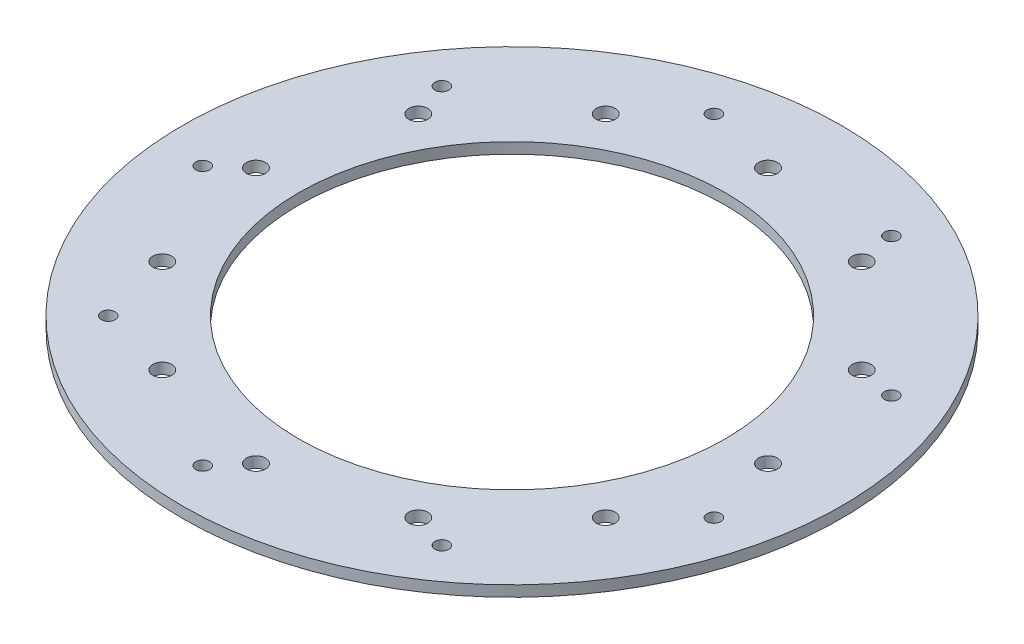
ISO-10303-21;
HEADER;
FILE_DESCRIPTION(('STEP AP214'),'2;1');
FILE_NAME('part.step','',(''),(''),'','','');
FILE_SCHEMA(('AUTOMOTIVE_DESIGN { 1 0 10303 214 1 1 1 1 }'));
ENDSEC;
DATA;
#1=APPLICATION_CONTEXT('core data for automotive mechanical design processes');
#2=APPLICATION_PROTOCOL_DEFINITION('international standard','automotive_design',2000,#1);
#3=PRODUCT_CONTEXT('',#1,'mechanical');
#4=PRODUCT('Part','Part','',(#3));
#5=PRODUCT_RELATED_PRODUCT_CATEGORY('part','',(#4));
#6=PRODUCT_DEFINITION_FORMATION('','',#4);
#7=PRODUCT_DEFINITION_CONTEXT('part definition',#1,'design');
#8=PRODUCT_DEFINITION('design','',#6,#7);
#9=PRODUCT_DEFINITION_SHAPE('','',#8);
#10=(LENGTH_UNIT() NAMED_UNIT(*) SI_UNIT(.MILLI.,.METRE.));
#11=(NAMED_UNIT(*) PLANE_ANGLE_UNIT() SI_UNIT($,.RADIAN.));
#12=(NAMED_UNIT(*) SI_UNIT($,.STERADIAN.) SOLID_ANGLE_UNIT());
#13=UNCERTAINTY_MEASURE_WITH_UNIT(LENGTH_MEASURE(1.E-05),#10,'distance_accuracy_value','');
#14=(GEOMETRIC_REPRESENTATION_CONTEXT(3) GLOBAL_UNCERTAINTY_ASSIGNED_CONTEXT((#13)) GLOBAL_UNIT_ASSIGNED_CONTEXT((#10,
#11,#12)) REPRESENTATION_CONTEXT('',''));
#15=CARTESIAN_POINT('',(0.,0.,0.));
#16=DIRECTION('',(0.,0.,1.));
#17=DIRECTION('',(1.,0.,0.));
#18=AXIS2_PLACEMENT_3D('',#15,#16,#17);
#19=CARTESIAN_POINT('',(0.,2.5,0.));
#20=DIRECTION('',(0.,1.,0.));
#21=DIRECTION('',(0.,0.,1.));
#22=AXIS2_PLACEMENT_3D('',#19,#20,#21);
#23=PLANE('',#22);
#24=CARTESIAN_POINT('',(-17.0820569767662,2.5,-63.7511045350786));
#25=DIRECTION('',(0.,1.,0.));
#26=DIRECTION('',(-0.984807753012209,0.,0.173648177666927));
#27=AXIS2_PLACEMENT_3D('',#24,#25,#26);
#28=CIRCLE('',#27,1.60000000000001);
#29=CARTESIAN_POINT('',(-18.6577493815857,2.5,-63.4732674508115));
#30=VERTEX_POINT('',#29);
#31=EDGE_CURVE('E170',#30,#30,#28,.T.);
#32=ORIENTED_EDGE('',*,*,#31,.F.);
#33=EDGE_LOOP('',(#32));
#34=FACE_BOUND('',#33,.T.);
#35=CARTESIAN_POINT('',(27.8928052748864,2.5,-59.8163139444188));
#36=DIRECTION('',(0.,1.,0.));
#37=DIRECTION('',(-0.866025403784436,0.,-0.500000000000004));
#38=AXIS2_PLACEMENT_3D('',#35,#36,#37);
#39=CIRCLE('',#38,1.60000000000001);
#40=CARTESIAN_POINT('',(26.5071646288313,2.5,-60.6163139444188));
#41=VERTEX_POINT('',#40);
#42=EDGE_CURVE('E164',#41,#41,#39,.T.);
#43=ORIENTED_EDGE('',*,*,#42,.F.);
#44=EDGE_LOOP('',(#43));
#45=FACE_BOUND('',#44,.T.);
#46=CARTESIAN_POINT('',(59.8163139444191,2.5,-27.8928052748858));
#47=DIRECTION('',(0.,1.,0.));
#48=DIRECTION('',(-0.342020143325663,0.,-0.939692620785911));
#49=AXIS2_PLACEMENT_3D('',#46,#47,#48);
#50=CIRCLE('',#49,1.60000000000001);
#51=CARTESIAN_POINT('',(59.269081715098,2.5,-29.3963134681433));
#52=VERTEX_POINT('',#51);
#53=EDGE_CURVE('E158',#52,#52,#50,.T.);
#54=ORIENTED_EDGE('',*,*,#53,.F.);
#55=EDGE_LOOP('',(#54));
#56=FACE_BOUND('',#55,.T.);
#57=CARTESIAN_POINT('',(63.7511045350784,2.5,17.0820569767668));
#58=DIRECTION('',(0.,1.,0.));
#59=DIRECTION('',(0.342020143325676,0.,-0.939692620785906));
#60=AXIS2_PLACEMENT_3D('',#57,#58,#59);
#61=CIRCLE('',#60,1.60000000000001);
#62=CARTESIAN_POINT('',(64.2983367643995,2.5,15.5785487835094));
#63=VERTEX_POINT('',#62);
#64=EDGE_CURVE('E152',#63,#63,#61,.T.);
#65=ORIENTED_EDGE('',*,*,#64,.F.);
#66=EDGE_LOOP('',(#65));
#67=FACE_BOUND('',#66,.T.);
#68=CARTESIAN_POINT('',(37.8560447991686,2.5,54.0640349230738));
#69=DIRECTION('',(0.,1.,0.));
#70=DIRECTION('',(0.866025403784443,0.,-0.499999999999992));
#71=AXIS2_PLACEMENT_3D('',#68,#69,#70);
#72=CIRCLE('',#71,1.60000000000001);
#73=CARTESIAN_POINT('',(39.2416854452237,2.5,53.2640349230738));
#74=VERTEX_POINT('',#73);
#75=EDGE_CURVE('E146',#74,#74,#72,.T.);
#76=ORIENTED_EDGE('',*,*,#75,.F.);
#77=EDGE_LOOP('',(#76));
#78=FACE_BOUND('',#77,.T.);
#79=CARTESIAN_POINT('',(-5.7522790213461,2.5,65.7488500740551));
#80=DIRECTION('',(0.,1.,0.));
#81=DIRECTION('',(0.984807753012206,0.,0.17364817766694));
#82=AXIS2_PLACEMENT_3D('',#79,#80,#81);
#83=CIRCLE('',#82,1.60000000000001);
#84=CARTESIAN_POINT('',(-4.17658661652657,2.5,66.0266871583223));
#85=VERTEX_POINT('',#84);
#86=EDGE_CURVE('E140',#85,#85,#83,.T.);
#87=ORIENTED_EDGE('',*,*,#86,.F.);
#88=EDGE_LOOP('',(#87));
#89=FACE_BOUND('',#88,.T.);
#90=CARTESIAN_POINT('',(-46.6690475583127,2.5,46.6690475583116));
#91=DIRECTION('',(0.,1.,0.));
#92=DIRECTION('',(0.64278760968653,0.,0.766044443118986));
#93=AXIS2_PLACEMENT_3D('',#90,#91,#92);
#94=CIRCLE('',#93,1.60000000000001);
#95=CARTESIAN_POINT('',(-45.6405873828143,2.5,47.894718667302));
#96=VERTEX_POINT('',#95);
#97=EDGE_CURVE('E134',#96,#96,#94,.T.);
#98=ORIENTED_EDGE('',*,*,#97,.F.);
#99=EDGE_LOOP('',(#98));
#100=FACE_BOUND('',#99,.T.);
#101=CARTESIAN_POINT('',(-54.0640349230734,2.5,-37.8560447991691));
#102=DIRECTION('',(0.,1.,0.));
#103=DIRECTION('',(-0.642787609686541,0.,0.766044443118977));
#104=AXIS2_PLACEMENT_3D('',#101,#102,#103);
#105=CIRCLE('',#104,1.60000000000001);
#106=CARTESIAN_POINT('',(-55.0924950985719,2.5,-36.6303736901788));
#107=VERTEX_POINT('',#106);
#108=EDGE_CURVE('E128',#107,#107,#105,.T.);
#109=ORIENTED_EDGE('',*,*,#108,.F.);
#110=EDGE_LOOP('',(#109));
#111=FACE_BOUND('',#110,.T.);
#112=CARTESIAN_POINT('',(29.5899999999978,2.5,-51.2513833959643));
#113=DIRECTION('',(0.,1.,0.));
#114=DIRECTION('',(0.,0.,1.));
#115=AXIS2_PLACEMENT_3D('',#112,#113,#114);
#116=CIRCLE('',#115,2.19999999999999);
#117=CARTESIAN_POINT('',(29.5899999999978,2.5,-49.0513833959643));
#118=VERTEX_POINT('',#117);
#119=EDGE_CURVE('E123',#118,#118,#116,.T.);
#120=ORIENTED_EDGE('',*,*,#119,.F.);
#121=EDGE_LOOP('',(#120));
#122=FACE_BOUND('',#121,.T.);
#123=CARTESIAN_POINT('',(51.2513833959618,2.5,-29.5900000000022));
#124=DIRECTION('',(0.,1.,0.));
#125=DIRECTION('',(0.,0.,1.));
#126=AXIS2_PLACEMENT_3D('',#123,#124,#125);
#127=CIRCLE('',#126,2.20000000000001);
#128=CARTESIAN_POINT('',(51.2513833959618,2.5,-27.3900000000022));
#129=VERTEX_POINT('',#128);
#130=EDGE_CURVE('E117',#129,#129,#127,.T.);
#131=ORIENTED_EDGE('',*,*,#130,.F.);
#132=EDGE_LOOP('',(#131));
#133=FACE_BOUND('',#132,.T.);
#134=CARTESIAN_POINT('',(59.18,2.5,-2.51925216798732E-12));
#135=DIRECTION('',(0.,1.,0.));
#136=DIRECTION('',(0.,0.,1.));
#137=AXIS2_PLACEMENT_3D('',#134,#135,#136);
#138=CIRCLE('',#137,2.2);
#139=CARTESIAN_POINT('',(59.18,2.5,2.19999999999748));
#140=VERTEX_POINT('',#139);
#141=EDGE_CURVE('E111',#140,#140,#138,.T.);
#142=ORIENTED_EDGE('',*,*,#141,.F.);
#143=EDGE_LOOP('',(#142));
#144=FACE_BOUND('',#143,.T.);
#145=CARTESIAN_POINT('',(51.2513833959643,2.5,29.5899999999978));
#146=DIRECTION('',(0.,1.,0.));
#147=DIRECTION('',(0.,0.,1.));
#148=AXIS2_PLACEMENT_3D('',#145,#146,#147);
#149=CIRCLE('',#148,2.2);
#150=CARTESIAN_POINT('',(51.2513833959643,2.5,31.7899999999978));
#151=VERTEX_POINT('',#150);
#152=EDGE_CURVE('E105',#151,#151,#149,.T.);
#153=ORIENTED_EDGE('',*,*,#152,.F.);
#154=EDGE_LOOP('',(#153));
#155=FACE_BOUND('',#154,.T.);
#156=CARTESIAN_POINT('',(29.5900000000022,2.5,51.2513833959618));
#157=DIRECTION('',(0.,1.,0.));
#158=DIRECTION('',(0.,0.,1.));
#159=AXIS2_PLACEMENT_3D('',#156,#157,#158);
#160=CIRCLE('',#159,2.2);
#161=CARTESIAN_POINT('',(29.5900000000022,2.5,53.4513833959618));
#162=VERTEX_POINT('',#161);
#163=EDGE_CURVE('E99',#162,#162,#160,.T.);
#164=ORIENTED_EDGE('',*,*,#163,.F.);
#165=EDGE_LOOP('',(#164));
#166=FACE_BOUND('',#165,.T.);
#167=CARTESIAN_POINT('',(2.5157214821059E-12,2.5,59.18));
#168=DIRECTION('',(0.,1.,0.));
#169=DIRECTION('',(0.,0.,1.));
#170=AXIS2_PLACEMENT_3D('',#167,#168,#169);
#171=CIRCLE('',#170,2.2);
#172=CARTESIAN_POINT('',(2.5157214821059E-12,2.5,61.38));
#173=VERTEX_POINT('',#172);
#174=EDGE_CURVE('E93',#173,#173,#171,.T.);
#175=ORIENTED_EDGE('',*,*,#174,.F.);
#176=EDGE_LOOP('',(#175));
#177=FACE_BOUND('',#176,.T.);
#178=CARTESIAN_POINT('',(-29.5899999999978,2.5,51.2513833959643));
#179=DIRECTION('',(0.,1.,0.));
#180=DIRECTION('',(0.,0.,1.));
#181=AXIS2_PLACEMENT_3D('',#178,#179,#180);
#182=CIRCLE('',#181,2.2);
#183=CARTESIAN_POINT('',(-29.5899999999978,2.5,53.4513833959643));
#184=VERTEX_POINT('',#183);
#185=EDGE_CURVE('E87',#184,#184,#182,.T.);
#186=ORIENTED_EDGE('',*,*,#185,.F.);
#187=EDGE_LOOP('',(#186));
#188=FACE_BOUND('',#187,.T.);
#189=CARTESIAN_POINT('',(-51.2513833959618,2.5,29.5900000000022));
#190=DIRECTION('',(0.,1.,0.));
#191=DIRECTION('',(0.,0.,1.));
#192=AXIS2_PLACEMENT_3D('',#189,#190,#191);
#193=CIRCLE('',#192,2.2);
#194=CARTESIAN_POINT('',(-51.2513833959618,2.5,31.7900000000022));
#195=VERTEX_POINT('',#194);
#196=EDGE_CURVE('E81',#195,#195,#193,.T.);
#197=ORIENTED_EDGE('',*,*,#196,.F.);
#198=EDGE_LOOP('',(#197));
#199=FACE_BOUND('',#198,.T.);
#200=CARTESIAN_POINT('',(-59.18,2.5,2.52662474276022E-12));
#201=DIRECTION('',(0.,1.,0.));
#202=DIRECTION('',(0.,0.,1.));
#203=AXIS2_PLACEMENT_3D('',#200,#201,#202);
#204=CIRCLE('',#203,2.2);
#205=CARTESIAN_POINT('',(-59.18,2.5,2.20000000000253));
#206=VERTEX_POINT('',#205);
#207=EDGE_CURVE('E75',#206,#206,#204,.T.);
#208=ORIENTED_EDGE('',*,*,#207,.F.);
#209=EDGE_LOOP('',(#208));
#210=FACE_BOUND('',#209,.T.);
#211=CARTESIAN_POINT('',(-51.2513833959643,2.5,-29.5899999999978));
#212=DIRECTION('',(0.,1.,0.));
#213=DIRECTION('',(0.,0.,1.));
#214=AXIS2_PLACEMENT_3D('',#211,#212,#213);
#215=CIRCLE('',#214,2.2);
#216=CARTESIAN_POINT('',(-51.2513833959643,2.5,-27.3899999999978));
#217=VERTEX_POINT('',#216);
#218=EDGE_CURVE('E69',#217,#217,#215,.T.);
#219=ORIENTED_EDGE('',*,*,#218,.F.);
#220=EDGE_LOOP('',(#219));
#221=FACE_BOUND('',#220,.T.);
#222=CARTESIAN_POINT('',(-29.5900000000022,2.5,-51.2513833959618));
#223=DIRECTION('',(0.,1.,0.));
#224=DIRECTION('',(0.,0.,1.));
#225=AXIS2_PLACEMENT_3D('',#222,#223,#224);
#226=CIRCLE('',#225,2.2);
#227=CARTESIAN_POINT('',(-29.5900000000022,2.5,-49.0513833959618));
#228=VERTEX_POINT('',#227);
#229=EDGE_CURVE('E62',#228,#228,#226,.T.);
#230=ORIENTED_EDGE('',*,*,#229,.F.);
#231=EDGE_LOOP('',(#230));
#232=FACE_BOUND('',#231,.T.);
#233=CARTESIAN_POINT('',(-2.51573553974758E-12,2.5,-59.18));
#234=DIRECTION('',(0.,1.,0.));
#235=DIRECTION('',(0.,0.,1.));
#236=AXIS2_PLACEMENT_3D('',#233,#234,#235);
#237=CIRCLE('',#236,2.2);
#238=CARTESIAN_POINT('',(-2.51573553974758E-12,2.5,-56.98));
#239=VERTEX_POINT('',#238);
#240=EDGE_CURVE('E56',#239,#239,#237,.T.);
#241=ORIENTED_EDGE('',*,*,#240,.F.);
#242=EDGE_LOOP('',(#241));
#243=FACE_BOUND('',#242,.T.);
#244=CARTESIAN_POINT('',(-65.7488500740552,2.5,5.75227902134545));
#245=DIRECTION('',(0.,1.,0.));
#246=DIRECTION('',(0.,0.,1.));
#247=AXIS2_PLACEMENT_3D('',#244,#245,#246);
#248=CIRCLE('',#247,1.60000000000001);
#249=CARTESIAN_POINT('',(-65.7488500740552,2.5,7.35227902134546));
#250=VERTEX_POINT('',#249);
#251=EDGE_CURVE('E50',#250,#250,#248,.T.);
#252=ORIENTED_EDGE('',*,*,#251,.F.);
#253=EDGE_LOOP('',(#252));
#254=FACE_BOUND('',#253,.T.);
#255=CARTESIAN_POINT('',(0.,2.5,0.));
#256=DIRECTION('',(0.,1.,0.));
#257=DIRECTION('',(0.,0.,1.));
#258=AXIS2_PLACEMENT_3D('',#255,#256,#257);
#259=CIRCLE('',#258,76.182);
#260=CARTESIAN_POINT('',(0.,2.5,76.182));
#261=VERTEX_POINT('',#260);
#262=EDGE_CURVE('E10',#261,#261,#259,.T.);
#263=ORIENTED_EDGE('',*,*,#262,.T.);
#264=EDGE_LOOP('',(#263));
#265=FACE_BOUND('',#264,.T.);
#266=CARTESIAN_POINT('',(0.,2.5,0.));
#267=DIRECTION('',(0.,1.,0.));
#268=DIRECTION('',(0.,0.,1.));
#269=AXIS2_PLACEMENT_3D('',#266,#267,#268);
#270=CIRCLE('',#269,49.3);
#271=CARTESIAN_POINT('',(0.,2.5,49.3));
#272=VERTEX_POINT('',#271);
#273=EDGE_CURVE('E42',#272,#272,#270,.T.);
#274=ORIENTED_EDGE('',*,*,#273,.F.);
#275=EDGE_LOOP('',(#274));
#276=FACE_BOUND('',#275,.T.);
#277=ADVANCED_FACE('F31',(#34,#45,#56,#67,#78,#89,#100,#111,#122,#133,#144,#155,#166,#177,#188,
#199,#210,#221,#232,#243,#254,#265,#276),#23,.T.);
#278=CARTESIAN_POINT('',(0.,0.,0.));
#279=DIRECTION('',(0.,1.,0.));
#280=DIRECTION('',(0.,0.,1.));
#281=AXIS2_PLACEMENT_3D('',#278,#279,#280);
#282=PLANE('',#281);
#283=CARTESIAN_POINT('',(-17.0820569767662,0.,-63.7511045350786));
#284=DIRECTION('',(0.,1.,0.));
#285=DIRECTION('',(-0.984807753012209,0.,0.173648177666927));
#286=AXIS2_PLACEMENT_3D('',#283,#284,#285);
#287=CIRCLE('',#286,1.60000000000001);
#288=CARTESIAN_POINT('',(-18.6577493815857,0.,-63.4732674508115));
#289=VERTEX_POINT('',#288);
#290=EDGE_CURVE('E131',#289,#289,#287,.T.);
#291=ORIENTED_EDGE('',*,*,#290,.T.);
#292=EDGE_LOOP('',(#291));
#293=FACE_BOUND('',#292,.T.);
#294=CARTESIAN_POINT('',(27.8928052748864,0.,-59.8163139444188));
#295=DIRECTION('',(0.,1.,0.));
#296=DIRECTION('',(-0.866025403784436,0.,-0.500000000000004));
#297=AXIS2_PLACEMENT_3D('',#294,#295,#296);
#298=CIRCLE('',#297,1.60000000000001);
#299=CARTESIAN_POINT('',(26.5071646288313,0.,-60.6163139444188));
#300=VERTEX_POINT('',#299);
#301=EDGE_CURVE('E167',#300,#300,#298,.T.);
#302=ORIENTED_EDGE('',*,*,#301,.T.);
#303=EDGE_LOOP('',(#302));
#304=FACE_BOUND('',#303,.T.);
#305=CARTESIAN_POINT('',(59.8163139444191,0.,-27.8928052748858));
#306=DIRECTION('',(0.,1.,0.));
#307=DIRECTION('',(-0.342020143325663,0.,-0.939692620785911));
#308=AXIS2_PLACEMENT_3D('',#305,#306,#307);
#309=CIRCLE('',#308,1.60000000000001);
#310=CARTESIAN_POINT('',(59.269081715098,0.,-29.3963134681433));
#311=VERTEX_POINT('',#310);
#312=EDGE_CURVE('E161',#311,#311,#309,.T.);
#313=ORIENTED_EDGE('',*,*,#312,.T.);
#314=EDGE_LOOP('',(#313));
#315=FACE_BOUND('',#314,.T.);
#316=CARTESIAN_POINT('',(63.7511045350784,0.,17.0820569767668));
#317=DIRECTION('',(0.,1.,0.));
#318=DIRECTION('',(0.342020143325676,0.,-0.939692620785906));
#319=AXIS2_PLACEMENT_3D('',#316,#317,#318);
#320=CIRCLE('',#319,1.60000000000001);
#321=CARTESIAN_POINT('',(64.2983367643995,0.,15.5785487835094));
#322=VERTEX_POINT('',#321);
#323=EDGE_CURVE('E155',#322,#322,#320,.T.);
#324=ORIENTED_EDGE('',*,*,#323,.T.);
#325=EDGE_LOOP('',(#324));
#326=FACE_BOUND('',#325,.T.);
#327=CARTESIAN_POINT('',(37.8560447991686,0.,54.0640349230738));
#328=DIRECTION('',(0.,1.,0.));
#329=DIRECTION('',(0.866025403784443,0.,-0.499999999999992));
#330=AXIS2_PLACEMENT_3D('',#327,#328,#329);
#331=CIRCLE('',#330,1.60000000000001);
#332=CARTESIAN_POINT('',(39.2416854452237,0.,53.2640349230738));
#333=VERTEX_POINT('',#332);
#334=EDGE_CURVE('E149',#333,#333,#331,.T.);
#335=ORIENTED_EDGE('',*,*,#334,.T.);
#336=EDGE_LOOP('',(#335));
#337=FACE_BOUND('',#336,.T.);
#338=CARTESIAN_POINT('',(-5.7522790213461,0.,65.7488500740551));
#339=DIRECTION('',(0.,1.,0.));
#340=DIRECTION('',(0.984807753012206,0.,0.17364817766694));
#341=AXIS2_PLACEMENT_3D('',#338,#339,#340);
#342=CIRCLE('',#341,1.60000000000001);
#343=CARTESIAN_POINT('',(-4.17658661652657,0.,66.0266871583223));
#344=VERTEX_POINT('',#343);
#345=EDGE_CURVE('E143',#344,#344,#342,.T.);
#346=ORIENTED_EDGE('',*,*,#345,.T.);
#347=EDGE_LOOP('',(#346));
#348=FACE_BOUND('',#347,.T.);
#349=CARTESIAN_POINT('',(-46.6690475583127,0.,46.6690475583116));
#350=DIRECTION('',(0.,1.,0.));
#351=DIRECTION('',(0.64278760968653,0.,0.766044443118986));
#352=AXIS2_PLACEMENT_3D('',#349,#350,#351);
#353=CIRCLE('',#352,1.60000000000001);
#354=CARTESIAN_POINT('',(-45.6405873828143,0.,47.894718667302));
#355=VERTEX_POINT('',#354);
#356=EDGE_CURVE('E137',#355,#355,#353,.T.);
#357=ORIENTED_EDGE('',*,*,#356,.T.);
#358=EDGE_LOOP('',(#357));
#359=FACE_BOUND('',#358,.T.);
#360=CARTESIAN_POINT('',(-54.0640349230734,0.,-37.8560447991691));
#361=DIRECTION('',(0.,1.,0.));
#362=DIRECTION('',(-0.642787609686541,0.,0.766044443118977));
#363=AXIS2_PLACEMENT_3D('',#360,#361,#362);
#364=CIRCLE('',#363,1.60000000000001);
#365=CARTESIAN_POINT('',(-55.0924950985719,0.,-36.6303736901788));
#366=VERTEX_POINT('',#365);
#367=EDGE_CURVE('E66',#366,#366,#364,.T.);
#368=ORIENTED_EDGE('',*,*,#367,.T.);
#369=EDGE_LOOP('',(#368));
#370=FACE_BOUND('',#369,.T.);
#371=CARTESIAN_POINT('',(29.5899999999978,0.,-51.2513833959643));
#372=DIRECTION('',(0.,1.,0.));
#373=DIRECTION('',(0.,0.,1.));
#374=AXIS2_PLACEMENT_3D('',#371,#372,#373);
#375=CIRCLE('',#374,2.19999999999999);
#376=CARTESIAN_POINT('',(29.5899999999978,0.,-49.0513833959643));
#377=VERTEX_POINT('',#376);
#378=EDGE_CURVE('E59',#377,#377,#375,.T.);
#379=ORIENTED_EDGE('',*,*,#378,.T.);
#380=EDGE_LOOP('',(#379));
#381=FACE_BOUND('',#380,.T.);
#382=CARTESIAN_POINT('',(51.2513833959618,0.,-29.5900000000022));
#383=DIRECTION('',(0.,1.,0.));
#384=DIRECTION('',(0.,0.,1.));
#385=AXIS2_PLACEMENT_3D('',#382,#383,#384);
#386=CIRCLE('',#385,2.20000000000001);
#387=CARTESIAN_POINT('',(51.2513833959618,0.,-27.3900000000022));
#388=VERTEX_POINT('',#387);
#389=EDGE_CURVE('E120',#388,#388,#386,.T.);
#390=ORIENTED_EDGE('',*,*,#389,.T.);
#391=EDGE_LOOP('',(#390));
#392=FACE_BOUND('',#391,.T.);
#393=CARTESIAN_POINT('',(59.18,0.,-2.51925216798732E-12));
#394=DIRECTION('',(0.,1.,0.));
#395=DIRECTION('',(0.,0.,1.));
#396=AXIS2_PLACEMENT_3D('',#393,#394,#395);
#397=CIRCLE('',#396,2.2);
#398=CARTESIAN_POINT('',(59.18,0.,2.19999999999748));
#399=VERTEX_POINT('',#398);
#400=EDGE_CURVE('E114',#399,#399,#397,.T.);
#401=ORIENTED_EDGE('',*,*,#400,.T.);
#402=EDGE_LOOP('',(#401));
#403=FACE_BOUND('',#402,.T.);
#404=CARTESIAN_POINT('',(51.2513833959643,0.,29.5899999999978));
#405=DIRECTION('',(0.,1.,0.));
#406=DIRECTION('',(0.,0.,1.));
#407=AXIS2_PLACEMENT_3D('',#404,#405,#406);
#408=CIRCLE('',#407,2.2);
#409=CARTESIAN_POINT('',(51.2513833959643,0.,31.7899999999978));
#410=VERTEX_POINT('',#409);
#411=EDGE_CURVE('E108',#410,#410,#408,.T.);
#412=ORIENTED_EDGE('',*,*,#411,.T.);
#413=EDGE_LOOP('',(#412));
#414=FACE_BOUND('',#413,.T.);
#415=CARTESIAN_POINT('',(29.5900000000022,0.,51.2513833959618));
#416=DIRECTION('',(0.,1.,0.));
#417=DIRECTION('',(0.,0.,1.));
#418=AXIS2_PLACEMENT_3D('',#415,#416,#417);
#419=CIRCLE('',#418,2.2);
#420=CARTESIAN_POINT('',(29.5900000000022,0.,53.4513833959618));
#421=VERTEX_POINT('',#420);
#422=EDGE_CURVE('E102',#421,#421,#419,.T.);
#423=ORIENTED_EDGE('',*,*,#422,.T.);
#424=EDGE_LOOP('',(#423));
#425=FACE_BOUND('',#424,.T.);
#426=CARTESIAN_POINT('',(2.5157214821059E-12,0.,59.18));
#427=DIRECTION('',(0.,1.,0.));
#428=DIRECTION('',(0.,0.,1.));
#429=AXIS2_PLACEMENT_3D('',#426,#427,#428);
#430=CIRCLE('',#429,2.2);
#431=CARTESIAN_POINT('',(2.5157214821059E-12,0.,61.38));
#432=VERTEX_POINT('',#431);
#433=EDGE_CURVE('E96',#432,#432,#430,.T.);
#434=ORIENTED_EDGE('',*,*,#433,.T.);
#435=EDGE_LOOP('',(#434));
#436=FACE_BOUND('',#435,.T.);
#437=CARTESIAN_POINT('',(-29.5899999999978,0.,51.2513833959643));
#438=DIRECTION('',(0.,1.,0.));
#439=DIRECTION('',(0.,0.,1.));
#440=AXIS2_PLACEMENT_3D('',#437,#438,#439);
#441=CIRCLE('',#440,2.2);
#442=CARTESIAN_POINT('',(-29.5899999999978,0.,53.4513833959643));
#443=VERTEX_POINT('',#442);
#444=EDGE_CURVE('E90',#443,#443,#441,.T.);
#445=ORIENTED_EDGE('',*,*,#444,.T.);
#446=EDGE_LOOP('',(#445));
#447=FACE_BOUND('',#446,.T.);
#448=CARTESIAN_POINT('',(-51.2513833959618,0.,29.5900000000022));
#449=DIRECTION('',(0.,1.,0.));
#450=DIRECTION('',(0.,0.,1.));
#451=AXIS2_PLACEMENT_3D('',#448,#449,#450);
#452=CIRCLE('',#451,2.2);
#453=CARTESIAN_POINT('',(-51.2513833959618,0.,31.7900000000022));
#454=VERTEX_POINT('',#453);
#455=EDGE_CURVE('E84',#454,#454,#452,.T.);
#456=ORIENTED_EDGE('',*,*,#455,.T.);
#457=EDGE_LOOP('',(#456));
#458=FACE_BOUND('',#457,.T.);
#459=CARTESIAN_POINT('',(-59.18,0.,2.52662474276022E-12));
#460=DIRECTION('',(0.,1.,0.));
#461=DIRECTION('',(0.,0.,1.));
#462=AXIS2_PLACEMENT_3D('',#459,#460,#461);
#463=CIRCLE('',#462,2.2);
#464=CARTESIAN_POINT('',(-59.18,0.,2.20000000000253));
#465=VERTEX_POINT('',#464);
#466=EDGE_CURVE('E78',#465,#465,#463,.T.);
#467=ORIENTED_EDGE('',*,*,#466,.T.);
#468=EDGE_LOOP('',(#467));
#469=FACE_BOUND('',#468,.T.);
#470=CARTESIAN_POINT('',(-51.2513833959643,0.,-29.5899999999978));
#471=DIRECTION('',(0.,1.,0.));
#472=DIRECTION('',(0.,0.,1.));
#473=AXIS2_PLACEMENT_3D('',#470,#471,#472);
#474=CIRCLE('',#473,2.2);
#475=CARTESIAN_POINT('',(-51.2513833959643,0.,-27.3899999999978));
#476=VERTEX_POINT('',#475);
#477=EDGE_CURVE('E72',#476,#476,#474,.T.);
#478=ORIENTED_EDGE('',*,*,#477,.T.);
#479=EDGE_LOOP('',(#478));
#480=FACE_BOUND('',#479,.T.);
#481=CARTESIAN_POINT('',(-29.5900000000022,0.,-51.2513833959618));
#482=DIRECTION('',(0.,1.,0.));
#483=DIRECTION('',(0.,0.,1.));
#484=AXIS2_PLACEMENT_3D('',#481,#482,#483);
#485=CIRCLE('',#484,2.2);
#486=CARTESIAN_POINT('',(-29.5900000000022,0.,-49.0513833959618));
#487=VERTEX_POINT('',#486);
#488=EDGE_CURVE('E65',#487,#487,#485,.T.);
#489=ORIENTED_EDGE('',*,*,#488,.T.);
#490=EDGE_LOOP('',(#489));
#491=FACE_BOUND('',#490,.T.);
#492=CARTESIAN_POINT('',(-2.51573553974758E-12,0.,-59.18));
#493=DIRECTION('',(0.,1.,0.));
#494=DIRECTION('',(0.,0.,1.));
#495=AXIS2_PLACEMENT_3D('',#492,#493,#494);
#496=CIRCLE('',#495,2.2);
#497=CARTESIAN_POINT('',(-2.51573553974758E-12,0.,-56.98));
#498=VERTEX_POINT('',#497);
#499=EDGE_CURVE('E53',#498,#498,#496,.T.);
#500=ORIENTED_EDGE('',*,*,#499,.T.);
#501=EDGE_LOOP('',(#500));
#502=FACE_BOUND('',#501,.T.);
#503=CARTESIAN_POINT('',(-65.7488500740552,0.,5.75227902134545));
#504=DIRECTION('',(0.,1.,0.));
#505=DIRECTION('',(0.,0.,1.));
#506=AXIS2_PLACEMENT_3D('',#503,#504,#505);
#507=CIRCLE('',#506,1.60000000000001);
#508=CARTESIAN_POINT('',(-65.7488500740552,0.,7.35227902134546));
#509=VERTEX_POINT('',#508);
#510=EDGE_CURVE('E47',#509,#509,#507,.T.);
#511=ORIENTED_EDGE('',*,*,#510,.T.);
#512=EDGE_LOOP('',(#511));
#513=FACE_BOUND('',#512,.T.);
#514=CARTESIAN_POINT('',(0.,0.,0.));
#515=DIRECTION('',(0.,1.,0.));
#516=DIRECTION('',(0.,0.,1.));
#517=AXIS2_PLACEMENT_3D('',#514,#515,#516);
#518=CIRCLE('',#517,76.182);
#519=CARTESIAN_POINT('',(0.,0.,76.182));
#520=VERTEX_POINT('',#519);
#521=EDGE_CURVE('E35',#520,#520,#518,.T.);
#522=ORIENTED_EDGE('',*,*,#521,.F.);
#523=EDGE_LOOP('',(#522));
#524=FACE_BOUND('',#523,.T.);
#525=CARTESIAN_POINT('',(0.,0.,0.));
#526=DIRECTION('',(0.,1.,0.));
#527=DIRECTION('',(0.,0.,1.));
#528=AXIS2_PLACEMENT_3D('',#525,#526,#527);
#529=CIRCLE('',#528,49.3);
#530=CARTESIAN_POINT('',(0.,0.,49.3));
#531=VERTEX_POINT('',#530);
#532=EDGE_CURVE('E44',#531,#531,#529,.T.);
#533=ORIENTED_EDGE('',*,*,#532,.T.);
#534=EDGE_LOOP('',(#533));
#535=FACE_BOUND('',#534,.T.);
#536=ADVANCED_FACE('F176',(#293,#304,#315,#326,#337,#348,#359,#370,#381,#392,#403,#414,#425,
#436,#447,#458,#469,#480,#491,#502,#513,#524,#535),#282,.F.);
#537=CARTESIAN_POINT('',(0.,2.5,0.));
#538=DIRECTION('',(0.,-1.,0.));
#539=DIRECTION('',(0.,0.,-1.));
#540=AXIS2_PLACEMENT_3D('',#537,#538,#539);
#541=CYLINDRICAL_SURFACE('',#540,76.182);
#542=ORIENTED_EDGE('',*,*,#262,.F.);
#543=EDGE_LOOP('',(#542));
#544=FACE_BOUND('',#543,.T.);
#545=ORIENTED_EDGE('',*,*,#521,.T.);
#546=EDGE_LOOP('',(#545));
#547=FACE_BOUND('',#546,.T.);
#548=ADVANCED_FACE('F33',(#544,#547),#541,.T.);
#549=CARTESIAN_POINT('',(0.,2.5,0.));
#550=DIRECTION('',(0.,-1.,0.));
#551=DIRECTION('',(0.,0.,-1.));
#552=AXIS2_PLACEMENT_3D('',#549,#550,#551);
#553=CYLINDRICAL_SURFACE('',#552,49.3);
#554=ORIENTED_EDGE('',*,*,#273,.T.);
#555=EDGE_LOOP('',(#554));
#556=FACE_BOUND('',#555,.T.);
#557=ORIENTED_EDGE('',*,*,#532,.F.);
#558=EDGE_LOOP('',(#557));
#559=FACE_BOUND('',#558,.T.);
#560=ADVANCED_FACE('F231',(#556,#559),#553,.F.);
#561=CARTESIAN_POINT('',(-65.7488500740552,0.,5.75227902134545));
#562=DIRECTION('',(0.,1.,0.));
#563=DIRECTION('',(0.,0.,1.));
#564=AXIS2_PLACEMENT_3D('',#561,#562,#563);
#565=CYLINDRICAL_SURFACE('',#564,1.60000000000001);
#566=ORIENTED_EDGE('',*,*,#510,.F.);
#567=EDGE_LOOP('',(#566));
#568=FACE_BOUND('',#567,.T.);
#569=ORIENTED_EDGE('',*,*,#251,.T.);
#570=EDGE_LOOP('',(#569));
#571=FACE_BOUND('',#570,.T.);
#572=ADVANCED_FACE('F234',(#568,#571),#565,.F.);
#573=CARTESIAN_POINT('',(-2.51573553974758E-12,0.,-59.18));
#574=DIRECTION('',(0.,1.,0.));
#575=DIRECTION('',(0.,0.,1.));
#576=AXIS2_PLACEMENT_3D('',#573,#574,#575);
#577=CYLINDRICAL_SURFACE('',#576,2.2);
#578=ORIENTED_EDGE('',*,*,#499,.F.);
#579=EDGE_LOOP('',(#578));
#580=FACE_BOUND('',#579,.T.);
#581=ORIENTED_EDGE('',*,*,#240,.T.);
#582=EDGE_LOOP('',(#581));
#583=FACE_BOUND('',#582,.T.);
#584=ADVANCED_FACE('F246',(#580,#583),#577,.F.);
#585=CARTESIAN_POINT('',(-29.5900000000022,0.,-51.2513833959618));
#586=DIRECTION('',(0.,1.,0.));
#587=DIRECTION('',(0.,0.,1.));
#588=AXIS2_PLACEMENT_3D('',#585,#586,#587);
#589=CYLINDRICAL_SURFACE('',#588,2.2);
#590=ORIENTED_EDGE('',*,*,#488,.F.);
#591=EDGE_LOOP('',(#590));
#592=FACE_BOUND('',#591,.T.);
#593=ORIENTED_EDGE('',*,*,#229,.T.);
#594=EDGE_LOOP('',(#593));
#595=FACE_BOUND('',#594,.T.);
#596=ADVANCED_FACE('F250',(#592,#595),#589,.F.);
#597=CARTESIAN_POINT('',(-51.2513833959643,0.,-29.5899999999978));
#598=DIRECTION('',(0.,1.,0.));
#599=DIRECTION('',(0.,0.,1.));
#600=AXIS2_PLACEMENT_3D('',#597,#598,#599);
#601=CYLINDRICAL_SURFACE('',#600,2.2);
#602=ORIENTED_EDGE('',*,*,#477,.F.);
#603=EDGE_LOOP('',(#602));
#604=FACE_BOUND('',#603,.T.);
#605=ORIENTED_EDGE('',*,*,#218,.T.);
#606=EDGE_LOOP('',(#605));
#607=FACE_BOUND('',#606,.T.);
#608=ADVANCED_FACE('F254',(#604,#607),#601,.F.);
#609=CARTESIAN_POINT('',(-59.18,0.,2.52662474276022E-12));
#610=DIRECTION('',(0.,1.,0.));
#611=DIRECTION('',(0.,0.,1.));
#612=AXIS2_PLACEMENT_3D('',#609,#610,#611);
#613=CYLINDRICAL_SURFACE('',#612,2.2);
#614=ORIENTED_EDGE('',*,*,#466,.F.);
#615=EDGE_LOOP('',(#614));
#616=FACE_BOUND('',#615,.T.);
#617=ORIENTED_EDGE('',*,*,#207,.T.);
#618=EDGE_LOOP('',(#617));
#619=FACE_BOUND('',#618,.T.);
#620=ADVANCED_FACE('F258',(#616,#619),#613,.F.);
#621=CARTESIAN_POINT('',(-51.2513833959618,0.,29.5900000000022));
#622=DIRECTION('',(0.,1.,0.));
#623=DIRECTION('',(0.,0.,1.));
#624=AXIS2_PLACEMENT_3D('',#621,#622,#623);
#625=CYLINDRICAL_SURFACE('',#624,2.2);
#626=ORIENTED_EDGE('',*,*,#455,.F.);
#627=EDGE_LOOP('',(#626));
#628=FACE_BOUND('',#627,.T.);
#629=ORIENTED_EDGE('',*,*,#196,.T.);
#630=EDGE_LOOP('',(#629));
#631=FACE_BOUND('',#630,.T.);
#632=ADVANCED_FACE('F262',(#628,#631),#625,.F.);
#633=CARTESIAN_POINT('',(-29.5899999999978,0.,51.2513833959643));
#634=DIRECTION('',(0.,1.,0.));
#635=DIRECTION('',(0.,0.,1.));
#636=AXIS2_PLACEMENT_3D('',#633,#634,#635);
#637=CYLINDRICAL_SURFACE('',#636,2.2);
#638=ORIENTED_EDGE('',*,*,#444,.F.);
#639=EDGE_LOOP('',(#638));
#640=FACE_BOUND('',#639,.T.);
#641=ORIENTED_EDGE('',*,*,#185,.T.);
#642=EDGE_LOOP('',(#641));
#643=FACE_BOUND('',#642,.T.);
#644=ADVANCED_FACE('F266',(#640,#643),#637,.F.);
#645=CARTESIAN_POINT('',(2.5157214821059E-12,0.,59.18));
#646=DIRECTION('',(0.,1.,0.));
#647=DIRECTION('',(0.,0.,1.));
#648=AXIS2_PLACEMENT_3D('',#645,#646,#647);
#649=CYLINDRICAL_SURFACE('',#648,2.2);
#650=ORIENTED_EDGE('',*,*,#433,.F.);
#651=EDGE_LOOP('',(#650));
#652=FACE_BOUND('',#651,.T.);
#653=ORIENTED_EDGE('',*,*,#174,.T.);
#654=EDGE_LOOP('',(#653));
#655=FACE_BOUND('',#654,.T.);
#656=ADVANCED_FACE('F270',(#652,#655),#649,.F.);
#657=CARTESIAN_POINT('',(29.5900000000022,0.,51.2513833959618));
#658=DIRECTION('',(0.,1.,0.));
#659=DIRECTION('',(0.,0.,1.));
#660=AXIS2_PLACEMENT_3D('',#657,#658,#659);
#661=CYLINDRICAL_SURFACE('',#660,2.2);
#662=ORIENTED_EDGE('',*,*,#422,.F.);
#663=EDGE_LOOP('',(#662));
#664=FACE_BOUND('',#663,.T.);
#665=ORIENTED_EDGE('',*,*,#163,.T.);
#666=EDGE_LOOP('',(#665));
#667=FACE_BOUND('',#666,.T.);
#668=ADVANCED_FACE('F274',(#664,#667),#661,.F.);
#669=CARTESIAN_POINT('',(51.2513833959643,0.,29.5899999999978));
#670=DIRECTION('',(0.,1.,0.));
#671=DIRECTION('',(0.,0.,1.));
#672=AXIS2_PLACEMENT_3D('',#669,#670,#671);
#673=CYLINDRICAL_SURFACE('',#672,2.2);
#674=ORIENTED_EDGE('',*,*,#411,.F.);
#675=EDGE_LOOP('',(#674));
#676=FACE_BOUND('',#675,.T.);
#677=ORIENTED_EDGE('',*,*,#152,.T.);
#678=EDGE_LOOP('',(#677));
#679=FACE_BOUND('',#678,.T.);
#680=ADVANCED_FACE('F278',(#676,#679),#673,.F.);
#681=CARTESIAN_POINT('',(59.18,0.,-2.51925216798732E-12));
#682=DIRECTION('',(0.,1.,0.));
#683=DIRECTION('',(0.,0.,1.));
#684=AXIS2_PLACEMENT_3D('',#681,#682,#683);
#685=CYLINDRICAL_SURFACE('',#684,2.2);
#686=ORIENTED_EDGE('',*,*,#400,.F.);
#687=EDGE_LOOP('',(#686));
#688=FACE_BOUND('',#687,.T.);
#689=ORIENTED_EDGE('',*,*,#141,.T.);
#690=EDGE_LOOP('',(#689));
#691=FACE_BOUND('',#690,.T.);
#692=ADVANCED_FACE('F282',(#688,#691),#685,.F.);
#693=CARTESIAN_POINT('',(51.2513833959618,0.,-29.5900000000022));
#694=DIRECTION('',(0.,1.,0.));
#695=DIRECTION('',(0.,0.,1.));
#696=AXIS2_PLACEMENT_3D('',#693,#694,#695);
#697=CYLINDRICAL_SURFACE('',#696,2.20000000000001);
#698=ORIENTED_EDGE('',*,*,#389,.F.);
#699=EDGE_LOOP('',(#698));
#700=FACE_BOUND('',#699,.T.);
#701=ORIENTED_EDGE('',*,*,#130,.T.);
#702=EDGE_LOOP('',(#701));
#703=FACE_BOUND('',#702,.T.);
#704=ADVANCED_FACE('F286',(#700,#703),#697,.F.);
#705=CARTESIAN_POINT('',(29.5899999999978,0.,-51.2513833959643));
#706=DIRECTION('',(0.,1.,0.));
#707=DIRECTION('',(0.,0.,1.));
#708=AXIS2_PLACEMENT_3D('',#705,#706,#707);
#709=CYLINDRICAL_SURFACE('',#708,2.19999999999999);
#710=ORIENTED_EDGE('',*,*,#378,.F.);
#711=EDGE_LOOP('',(#710));
#712=FACE_BOUND('',#711,.T.);
#713=ORIENTED_EDGE('',*,*,#119,.T.);
#714=EDGE_LOOP('',(#713));
#715=FACE_BOUND('',#714,.T.);
#716=ADVANCED_FACE('F290',(#712,#715),#709,.F.);
#717=CARTESIAN_POINT('',(-54.0640349230734,0.,-37.8560447991691));
#718=DIRECTION('',(0.,1.,0.));
#719=DIRECTION('',(0.,0.,1.));
#720=AXIS2_PLACEMENT_3D('',#717,#718,#719);
#721=CYLINDRICAL_SURFACE('',#720,1.60000000000001);
#722=ORIENTED_EDGE('',*,*,#367,.F.);
#723=EDGE_LOOP('',(#722));
#724=FACE_BOUND('',#723,.T.);
#725=ORIENTED_EDGE('',*,*,#108,.T.);
#726=EDGE_LOOP('',(#725));
#727=FACE_BOUND('',#726,.T.);
#728=ADVANCED_FACE('F294',(#724,#727),#721,.F.);
#729=CARTESIAN_POINT('',(-46.6690475583127,0.,46.6690475583116));
#730=DIRECTION('',(0.,1.,0.));
#731=DIRECTION('',(0.,0.,1.));
#732=AXIS2_PLACEMENT_3D('',#729,#730,#731);
#733=CYLINDRICAL_SURFACE('',#732,1.60000000000001);
#734=ORIENTED_EDGE('',*,*,#356,.F.);
#735=EDGE_LOOP('',(#734));
#736=FACE_BOUND('',#735,.T.);
#737=ORIENTED_EDGE('',*,*,#97,.T.);
#738=EDGE_LOOP('',(#737));
#739=FACE_BOUND('',#738,.T.);
#740=ADVANCED_FACE('F298',(#736,#739),#733,.F.);
#741=CARTESIAN_POINT('',(-5.7522790213461,0.,65.7488500740551));
#742=DIRECTION('',(0.,1.,0.));
#743=DIRECTION('',(0.,0.,1.));
#744=AXIS2_PLACEMENT_3D('',#741,#742,#743);
#745=CYLINDRICAL_SURFACE('',#744,1.60000000000001);
#746=ORIENTED_EDGE('',*,*,#345,.F.);
#747=EDGE_LOOP('',(#746));
#748=FACE_BOUND('',#747,.T.);
#749=ORIENTED_EDGE('',*,*,#86,.T.);
#750=EDGE_LOOP('',(#749));
#751=FACE_BOUND('',#750,.T.);
#752=ADVANCED_FACE('F302',(#748,#751),#745,.F.);
#753=CARTESIAN_POINT('',(37.8560447991686,0.,54.0640349230738));
#754=DIRECTION('',(0.,1.,0.));
#755=DIRECTION('',(0.,0.,1.));
#756=AXIS2_PLACEMENT_3D('',#753,#754,#755);
#757=CYLINDRICAL_SURFACE('',#756,1.60000000000001);
#758=ORIENTED_EDGE('',*,*,#334,.F.);
#759=EDGE_LOOP('',(#758));
#760=FACE_BOUND('',#759,.T.);
#761=ORIENTED_EDGE('',*,*,#75,.T.);
#762=EDGE_LOOP('',(#761));
#763=FACE_BOUND('',#762,.T.);
#764=ADVANCED_FACE('F306',(#760,#763),#757,.F.);
#765=CARTESIAN_POINT('',(63.7511045350784,0.,17.0820569767668));
#766=DIRECTION('',(0.,1.,0.));
#767=DIRECTION('',(0.,0.,1.));
#768=AXIS2_PLACEMENT_3D('',#765,#766,#767);
#769=CYLINDRICAL_SURFACE('',#768,1.60000000000001);
#770=ORIENTED_EDGE('',*,*,#323,.F.);
#771=EDGE_LOOP('',(#770));
#772=FACE_BOUND('',#771,.T.);
#773=ORIENTED_EDGE('',*,*,#64,.T.);
#774=EDGE_LOOP('',(#773));
#775=FACE_BOUND('',#774,.T.);
#776=ADVANCED_FACE('F310',(#772,#775),#769,.F.);
#777=CARTESIAN_POINT('',(59.8163139444191,0.,-27.8928052748858));
#778=DIRECTION('',(0.,1.,0.));
#779=DIRECTION('',(0.,0.,1.));
#780=AXIS2_PLACEMENT_3D('',#777,#778,#779);
#781=CYLINDRICAL_SURFACE('',#780,1.60000000000001);
#782=ORIENTED_EDGE('',*,*,#312,.F.);
#783=EDGE_LOOP('',(#782));
#784=FACE_BOUND('',#783,.T.);
#785=ORIENTED_EDGE('',*,*,#53,.T.);
#786=EDGE_LOOP('',(#785));
#787=FACE_BOUND('',#786,.T.);
#788=ADVANCED_FACE('F314',(#784,#787),#781,.F.);
#789=CARTESIAN_POINT('',(27.8928052748864,0.,-59.8163139444188));
#790=DIRECTION('',(0.,1.,0.));
#791=DIRECTION('',(0.,0.,1.));
#792=AXIS2_PLACEMENT_3D('',#789,#790,#791);
#793=CYLINDRICAL_SURFACE('',#792,1.60000000000001);
#794=ORIENTED_EDGE('',*,*,#301,.F.);
#795=EDGE_LOOP('',(#794));
#796=FACE_BOUND('',#795,.T.);
#797=ORIENTED_EDGE('',*,*,#42,.T.);
#798=EDGE_LOOP('',(#797));
#799=FACE_BOUND('',#798,.T.);
#800=ADVANCED_FACE('F182',(#796,#799),#793,.F.);
#801=CARTESIAN_POINT('',(-17.0820569767662,0.,-63.7511045350786));
#802=DIRECTION('',(0.,1.,0.));
#803=DIRECTION('',(0.,0.,1.));
#804=AXIS2_PLACEMENT_3D('',#801,#802,#803);
#805=CYLINDRICAL_SURFACE('',#804,1.60000000000001);
#806=ORIENTED_EDGE('',*,*,#290,.F.);
#807=EDGE_LOOP('',(#806));
#808=FACE_BOUND('',#807,.T.);
#809=ORIENTED_EDGE('',*,*,#31,.T.);
#810=EDGE_LOOP('',(#809));
#811=FACE_BOUND('',#810,.T.);
#812=ADVANCED_FACE('F179',(#808,#811),#805,.F.);
#813=CLOSED_SHELL('',(#277,#536,#548,#560,#572,#584,#596,#608,#620,#632,#644,#656,#668,#680,
#692,#704,#716,#728,#740,#752,#764,#776,#788,#800,#812));
#814=MANIFOLD_SOLID_BREP('B2',#813);
#815=ADVANCED_BREP_SHAPE_REPRESENTATION('',(#18,#814),#14);
#816=SHAPE_DEFINITION_REPRESENTATION(#9,#815);
ENDSEC;
END-ISO-10303-21;
